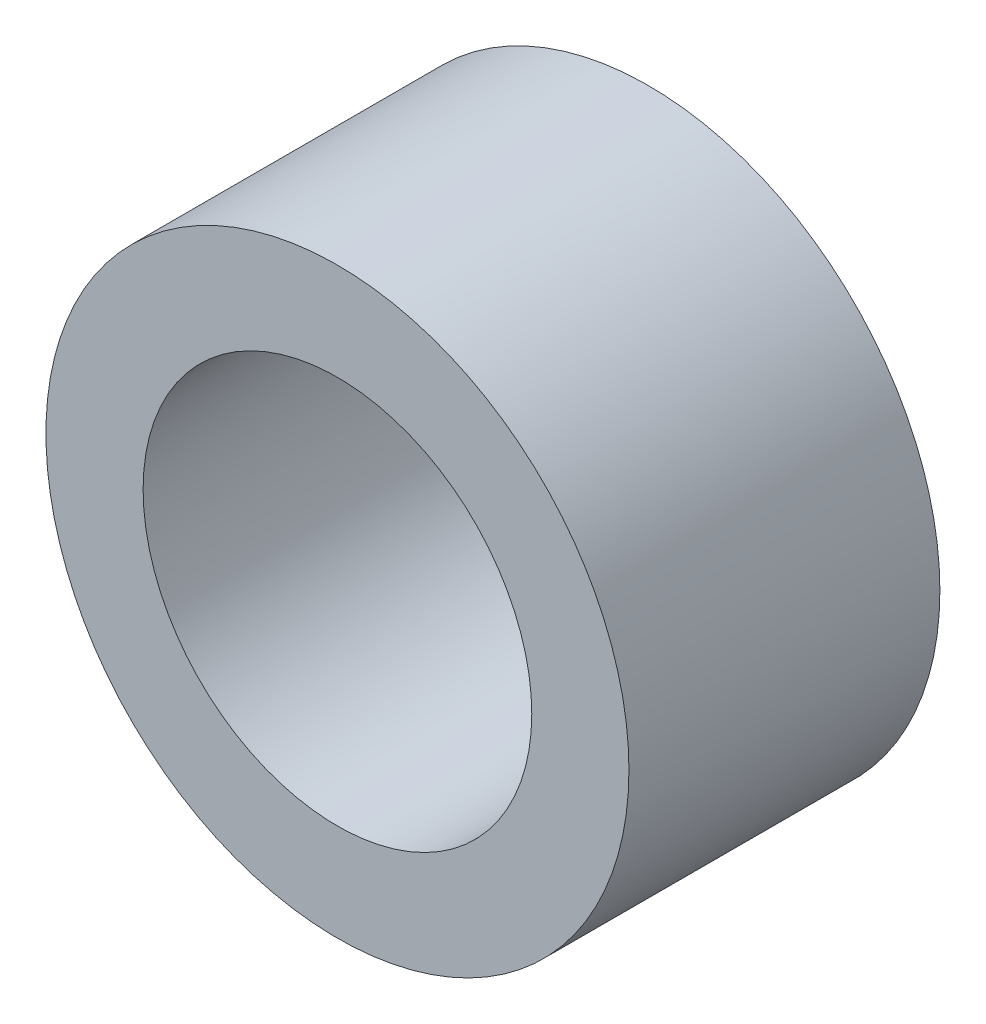
ISO-10303-21;
HEADER;
FILE_DESCRIPTION(('STEP AP214'),'2;1');
FILE_NAME('part.step','',(''),(''),'','','');
FILE_SCHEMA(('AUTOMOTIVE_DESIGN { 1 0 10303 214 1 1 1 1 }'));
ENDSEC;
DATA;
#1=APPLICATION_CONTEXT('core data for automotive mechanical design processes');
#2=APPLICATION_PROTOCOL_DEFINITION('international standard','automotive_design',2000,#1);
#3=PRODUCT_CONTEXT('',#1,'mechanical');
#4=PRODUCT('Part','Part','',(#3));
#5=PRODUCT_RELATED_PRODUCT_CATEGORY('part','',(#4));
#6=PRODUCT_DEFINITION_FORMATION('','',#4);
#7=PRODUCT_DEFINITION_CONTEXT('part definition',#1,'design');
#8=PRODUCT_DEFINITION('design','',#6,#7);
#9=PRODUCT_DEFINITION_SHAPE('','',#8);
#10=(LENGTH_UNIT() NAMED_UNIT(*) SI_UNIT(.MILLI.,.METRE.));
#11=(NAMED_UNIT(*) PLANE_ANGLE_UNIT() SI_UNIT($,.RADIAN.));
#12=(NAMED_UNIT(*) SI_UNIT($,.STERADIAN.) SOLID_ANGLE_UNIT());
#13=UNCERTAINTY_MEASURE_WITH_UNIT(LENGTH_MEASURE(1.E-05),#10,'distance_accuracy_value','');
#14=(GEOMETRIC_REPRESENTATION_CONTEXT(3) GLOBAL_UNCERTAINTY_ASSIGNED_CONTEXT((#13)) GLOBAL_UNIT_ASSIGNED_CONTEXT((#10,
#11,#12)) REPRESENTATION_CONTEXT('',''));
#15=CARTESIAN_POINT('',(0.,0.,0.));
#16=DIRECTION('',(0.,0.,1.));
#17=DIRECTION('',(1.,0.,0.));
#18=AXIS2_PLACEMENT_3D('',#15,#16,#17);
#19=CARTESIAN_POINT('',(0.,0.,8.));
#20=DIRECTION('',(0.,0.,1.));
#21=DIRECTION('',(1.,0.,0.));
#22=AXIS2_PLACEMENT_3D('',#19,#20,#21);
#23=PLANE('',#22);
#24=CARTESIAN_POINT('',(0.,0.,8.));
#25=DIRECTION('',(0.,0.,1.));
#26=DIRECTION('',(1.,0.,0.));
#27=AXIS2_PLACEMENT_3D('',#24,#25,#26);
#28=CIRCLE('',#27,7.5);
#29=CARTESIAN_POINT('',(7.5,0.,8.));
#30=VERTEX_POINT('',#29);
#31=EDGE_CURVE('E10',#30,#30,#28,.T.);
#32=ORIENTED_EDGE('',*,*,#31,.T.);
#33=EDGE_LOOP('',(#32));
#34=FACE_BOUND('',#33,.T.);
#35=CARTESIAN_POINT('',(0.,0.,8.));
#36=DIRECTION('',(0.,0.,1.));
#37=DIRECTION('',(1.,0.,0.));
#38=AXIS2_PLACEMENT_3D('',#35,#36,#37);
#39=CIRCLE('',#38,5.);
#40=CARTESIAN_POINT('',(5.,0.,8.));
#41=VERTEX_POINT('',#40);
#42=EDGE_CURVE('E42',#41,#41,#39,.T.);
#43=ORIENTED_EDGE('',*,*,#42,.F.);
#44=EDGE_LOOP('',(#43));
#45=FACE_BOUND('',#44,.T.);
#46=ADVANCED_FACE('F31',(#34,#45),#23,.T.);
#47=CARTESIAN_POINT('',(0.,0.,0.));
#48=DIRECTION('',(0.,0.,1.));
#49=DIRECTION('',(1.,0.,0.));
#50=AXIS2_PLACEMENT_3D('',#47,#48,#49);
#51=PLANE('',#50);
#52=CARTESIAN_POINT('',(0.,0.,0.));
#53=DIRECTION('',(0.,0.,1.));
#54=DIRECTION('',(1.,0.,0.));
#55=AXIS2_PLACEMENT_3D('',#52,#53,#54);
#56=CIRCLE('',#55,7.5);
#57=CARTESIAN_POINT('',(7.5,0.,0.));
#58=VERTEX_POINT('',#57);
#59=EDGE_CURVE('E35',#58,#58,#56,.T.);
#60=ORIENTED_EDGE('',*,*,#59,.F.);
#61=EDGE_LOOP('',(#60));
#62=FACE_BOUND('',#61,.T.);
#63=CARTESIAN_POINT('',(0.,0.,0.));
#64=DIRECTION('',(0.,0.,1.));
#65=DIRECTION('',(1.,0.,0.));
#66=AXIS2_PLACEMENT_3D('',#63,#64,#65);
#67=CIRCLE('',#66,5.);
#68=CARTESIAN_POINT('',(5.,0.,0.));
#69=VERTEX_POINT('',#68);
#70=EDGE_CURVE('E44',#69,#69,#67,.T.);
#71=ORIENTED_EDGE('',*,*,#70,.T.);
#72=EDGE_LOOP('',(#71));
#73=FACE_BOUND('',#72,.T.);
#74=ADVANCED_FACE('F54',(#62,#73),#51,.F.);
#75=CARTESIAN_POINT('',(0.,0.,8.));
#76=DIRECTION('',(0.,0.,-1.));
#77=DIRECTION('',(-1.,0.,0.));
#78=AXIS2_PLACEMENT_3D('',#75,#76,#77);
#79=CYLINDRICAL_SURFACE('',#78,7.5);
#80=ORIENTED_EDGE('',*,*,#31,.F.);
#81=EDGE_LOOP('',(#80));
#82=FACE_BOUND('',#81,.T.);
#83=ORIENTED_EDGE('',*,*,#59,.T.);
#84=EDGE_LOOP('',(#83));
#85=FACE_BOUND('',#84,.T.);
#86=ADVANCED_FACE('F33',(#82,#85),#79,.T.);
#87=CARTESIAN_POINT('',(0.,0.,8.));
#88=DIRECTION('',(0.,0.,-1.));
#89=DIRECTION('',(-1.,0.,0.));
#90=AXIS2_PLACEMENT_3D('',#87,#88,#89);
#91=CYLINDRICAL_SURFACE('',#90,5.);
#92=ORIENTED_EDGE('',*,*,#42,.T.);
#93=EDGE_LOOP('',(#92));
#94=FACE_BOUND('',#93,.T.);
#95=ORIENTED_EDGE('',*,*,#70,.F.);
#96=EDGE_LOOP('',(#95));
#97=FACE_BOUND('',#96,.T.);
#98=ADVANCED_FACE('F50',(#94,#97),#91,.F.);
#99=CLOSED_SHELL('',(#46,#74,#86,#98));
#100=MANIFOLD_SOLID_BREP('B2',#99);
#101=ADVANCED_BREP_SHAPE_REPRESENTATION('',(#18,#100),#14);
#102=SHAPE_DEFINITION_REPRESENTATION(#9,#101);
ENDSEC;
END-ISO-10303-21;
